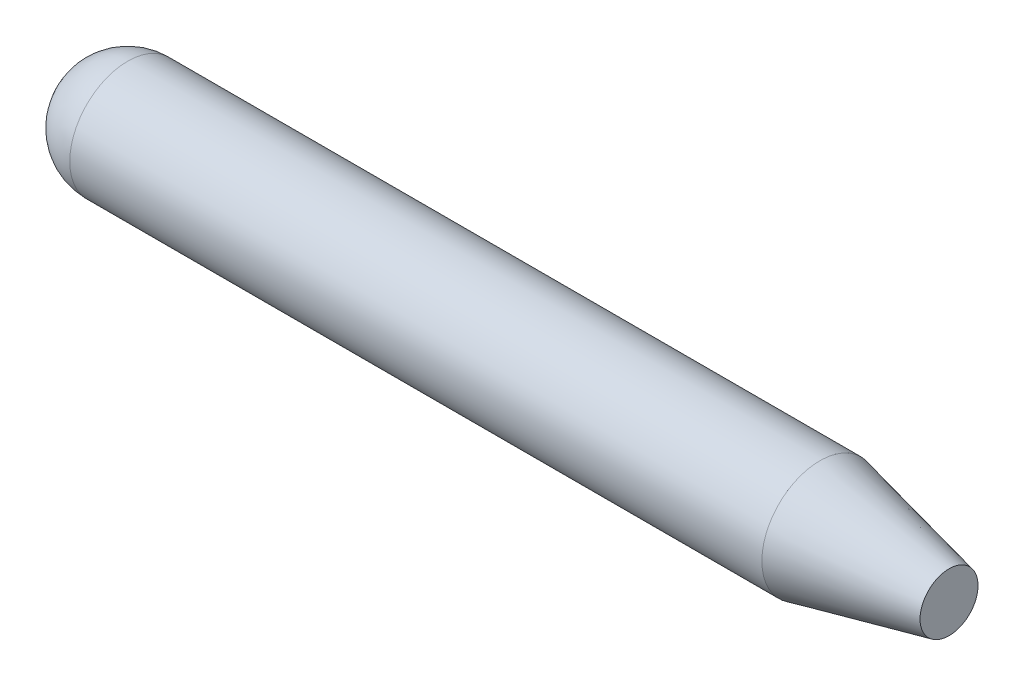
ISO-10303-21;
HEADER;
FILE_DESCRIPTION(('STEP AP214'),'2;1');
FILE_NAME('part.step','',(''),(''),'','','');
FILE_SCHEMA(('AUTOMOTIVE_DESIGN { 1 0 10303 214 1 1 1 1 }'));
ENDSEC;
DATA;
#1=APPLICATION_CONTEXT('core data for automotive mechanical design processes');
#2=APPLICATION_PROTOCOL_DEFINITION('international standard','automotive_design',2000,#1);
#3=PRODUCT_CONTEXT('',#1,'mechanical');
#4=PRODUCT('Part','Part','',(#3));
#5=PRODUCT_RELATED_PRODUCT_CATEGORY('part','',(#4));
#6=PRODUCT_DEFINITION_FORMATION('','',#4);
#7=PRODUCT_DEFINITION_CONTEXT('part definition',#1,'design');
#8=PRODUCT_DEFINITION('design','',#6,#7);
#9=PRODUCT_DEFINITION_SHAPE('','',#8);
#10=(LENGTH_UNIT() NAMED_UNIT(*) SI_UNIT(.MILLI.,.METRE.));
#11=(NAMED_UNIT(*) PLANE_ANGLE_UNIT() SI_UNIT($,.RADIAN.));
#12=(NAMED_UNIT(*) SI_UNIT($,.STERADIAN.) SOLID_ANGLE_UNIT());
#13=UNCERTAINTY_MEASURE_WITH_UNIT(LENGTH_MEASURE(1.E-05),#10,'distance_accuracy_value','');
#14=(GEOMETRIC_REPRESENTATION_CONTEXT(3) GLOBAL_UNCERTAINTY_ASSIGNED_CONTEXT((#13)) GLOBAL_UNIT_ASSIGNED_CONTEXT((#10,
#11,#12)) REPRESENTATION_CONTEXT('',''));
#15=CARTESIAN_POINT('',(0.,0.,0.));
#16=DIRECTION('',(0.,0.,1.));
#17=DIRECTION('',(1.,0.,0.));
#18=AXIS2_PLACEMENT_3D('',#15,#16,#17);
#19=CARTESIAN_POINT('',(-449.58,0.,0.));
#20=DIRECTION('',(-1.,0.,0.));
#21=DIRECTION('',(0.,1.,0.));
#22=AXIS2_PLACEMENT_3D('',#19,#20,#21);
#23=SPHERICAL_SURFACE('',#22,68.58);
#24=CARTESIAN_POINT('',(-449.58,0.,0.));
#25=DIRECTION('',(-1.,0.,0.));
#26=DIRECTION('',(0.,0.,1.));
#27=AXIS2_PLACEMENT_3D('',#24,#25,#26);
#28=CIRCLE('',#27,68.58);
#29=CARTESIAN_POINT('',(-449.58,0.,68.58));
#30=VERTEX_POINT('',#29);
#31=EDGE_CURVE('E50',#30,#30,#28,.T.);
#32=ORIENTED_EDGE('',*,*,#31,.T.);
#33=EDGE_LOOP('',(#32));
#34=FACE_BOUND('',#33,.T.);
#35=ADVANCED_FACE('F38',(#34),#23,.T.);
#36=CARTESIAN_POINT('',(522.115199787699,34.3254035238339,0.));
#37=DIRECTION('',(-1.,0.,0.));
#38=DIRECTION('',(0.,0.,1.));
#39=AXIS2_PLACEMENT_3D('',#36,#37,#38);
#40=PLANE('',#39);
#41=CARTESIAN_POINT('',(522.115199787699,0.,0.));
#42=DIRECTION('',(-1.,0.,0.));
#43=DIRECTION('',(0.,0.,1.));
#44=AXIS2_PLACEMENT_3D('',#41,#42,#43);
#45=CIRCLE('',#44,34.3254035238339);
#46=CARTESIAN_POINT('',(522.115199787699,0.,34.3254035238339));
#47=VERTEX_POINT('',#46);
#48=EDGE_CURVE('E10',#47,#47,#45,.T.);
#49=ORIENTED_EDGE('',*,*,#48,.F.);
#50=EDGE_LOOP('',(#49));
#51=FACE_BOUND('',#50,.T.);
#52=ADVANCED_FACE('F66',(#51),#40,.F.);
#53=CARTESIAN_POINT('',(522.115199787699,0.,0.));
#54=DIRECTION('',(-1.,0.,0.));
#55=DIRECTION('',(0.,0.,1.));
#56=AXIS2_PLACEMENT_3D('',#53,#54,#55);
#57=CONICAL_SURFACE('',#56,34.3254035238339,0.220439024132309);
#58=CARTESIAN_POINT('',(369.247793025498,0.,0.));
#59=DIRECTION('',(-1.,0.,0.));
#60=DIRECTION('',(0.,0.,1.));
#61=AXIS2_PLACEMENT_3D('',#58,#59,#60);
#62=CIRCLE('',#61,68.58);
#63=CARTESIAN_POINT('',(369.247793025498,0.,68.58));
#64=VERTEX_POINT('',#63);
#65=EDGE_CURVE('E45',#64,#64,#62,.T.);
#66=ORIENTED_EDGE('',*,*,#65,.F.);
#67=EDGE_LOOP('',(#66));
#68=FACE_BOUND('',#67,.T.);
#69=ORIENTED_EDGE('',*,*,#48,.T.);
#70=EDGE_LOOP('',(#69));
#71=FACE_BOUND('',#70,.T.);
#72=ADVANCED_FACE('F61',(#68,#71),#57,.T.);
#73=CARTESIAN_POINT('',(-518.16,0.,0.));
#74=DIRECTION('',(-1.,0.,0.));
#75=DIRECTION('',(0.,0.,1.));
#76=AXIS2_PLACEMENT_3D('',#73,#74,#75);
#77=CYLINDRICAL_SURFACE('',#76,68.58);
#78=ORIENTED_EDGE('',*,*,#31,.F.);
#79=EDGE_LOOP('',(#78));
#80=FACE_BOUND('',#79,.T.);
#81=ORIENTED_EDGE('',*,*,#65,.T.);
#82=EDGE_LOOP('',(#81));
#83=FACE_BOUND('',#82,.T.);
#84=ADVANCED_FACE('F59',(#80,#83),#77,.T.);
#85=CLOSED_SHELL('',(#35,#52,#72,#84));
#86=MANIFOLD_SOLID_BREP('B2',#85);
#87=ADVANCED_BREP_SHAPE_REPRESENTATION('',(#18,#86),#14);
#88=SHAPE_DEFINITION_REPRESENTATION(#9,#87);
ENDSEC;
END-ISO-10303-21;
